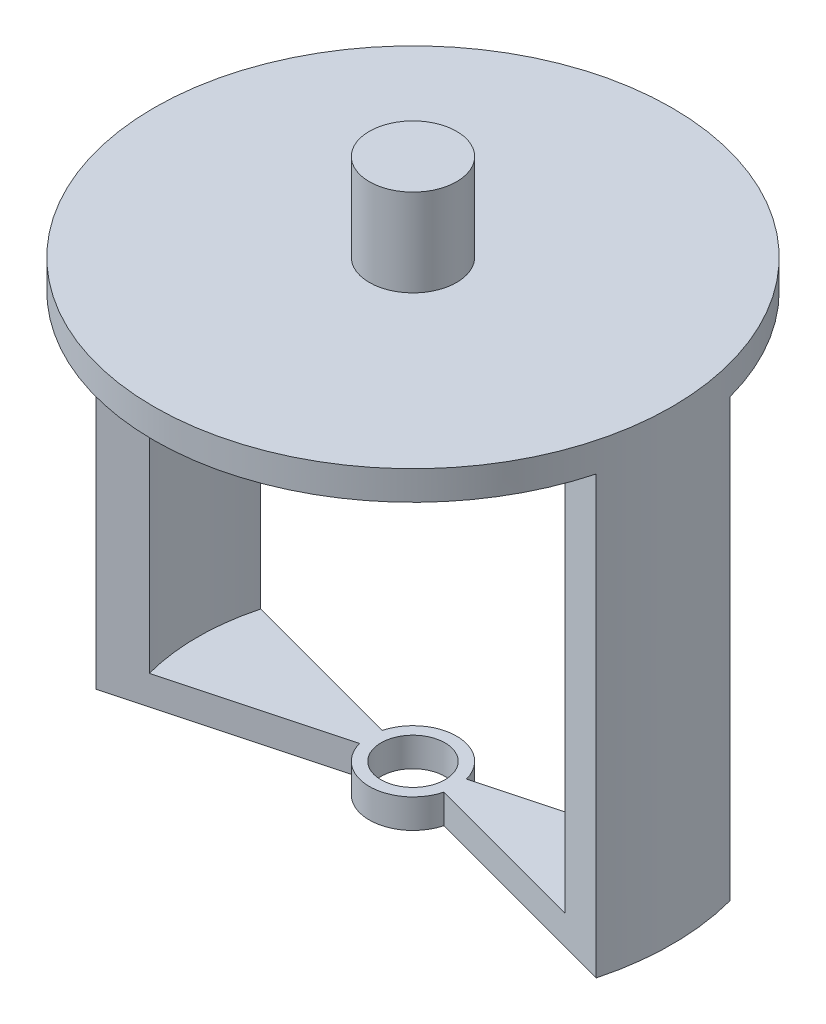
ISO-10303-21;
HEADER;
FILE_DESCRIPTION(('STEP AP214'),'2;1');
FILE_NAME('part.step','',(''),(''),'','','');
FILE_SCHEMA(('AUTOMOTIVE_DESIGN { 1 0 10303 214 1 1 1 1 }'));
ENDSEC;
DATA;
#1=APPLICATION_CONTEXT('core data for automotive mechanical design processes');
#2=APPLICATION_PROTOCOL_DEFINITION('international standard','automotive_design',2000,#1);
#3=PRODUCT_CONTEXT('',#1,'mechanical');
#4=PRODUCT('Part','Part','',(#3));
#5=PRODUCT_RELATED_PRODUCT_CATEGORY('part','',(#4));
#6=PRODUCT_DEFINITION_FORMATION('','',#4);
#7=PRODUCT_DEFINITION_CONTEXT('part definition',#1,'design');
#8=PRODUCT_DEFINITION('design','',#6,#7);
#9=PRODUCT_DEFINITION_SHAPE('','',#8);
#10=(LENGTH_UNIT() NAMED_UNIT(*) SI_UNIT(.MILLI.,.METRE.));
#11=(NAMED_UNIT(*) PLANE_ANGLE_UNIT() SI_UNIT($,.RADIAN.));
#12=(NAMED_UNIT(*) SI_UNIT($,.STERADIAN.) SOLID_ANGLE_UNIT());
#13=UNCERTAINTY_MEASURE_WITH_UNIT(LENGTH_MEASURE(1.E-05),#10,'distance_accuracy_value','');
#14=(GEOMETRIC_REPRESENTATION_CONTEXT(3) GLOBAL_UNCERTAINTY_ASSIGNED_CONTEXT((#13)) GLOBAL_UNIT_ASSIGNED_CONTEXT((#10,
#11,#12)) REPRESENTATION_CONTEXT('',''));
#15=CARTESIAN_POINT('',(0.,0.,0.));
#16=DIRECTION('',(0.,0.,1.));
#17=DIRECTION('',(1.,0.,0.));
#18=AXIS2_PLACEMENT_3D('',#15,#16,#17);
#19=CARTESIAN_POINT('',(0.,-40.,0.));
#20=DIRECTION('',(0.,1.,0.));
#21=DIRECTION('',(0.,0.,1.));
#22=AXIS2_PLACEMENT_3D('',#19,#20,#21);
#23=CYLINDRICAL_SURFACE('',#22,44.5);
#24=DIRECTION('',(0.,-1.,0.));
#25=VECTOR('',#24,1.);
#26=CARTESIAN_POINT('',(-42.9836992698635,35.,-11.5174475070622));
#27=LINE('',#26,#25);
#28=CARTESIAN_POINT('',(-42.9836992698635,35.,-11.5174475070622));
#29=VERTEX_POINT('',#28);
#30=CARTESIAN_POINT('',(-42.9836992698635,-40.,-11.5174475070622));
#31=VERTEX_POINT('',#30);
#32=EDGE_CURVE('E155',#29,#31,#27,.T.);
#33=ORIENTED_EDGE('',*,*,#32,.T.);
#34=CARTESIAN_POINT('',(0.,-40.,0.));
#35=DIRECTION('',(0.,1.,0.));
#36=DIRECTION('',(0.,0.,1.));
#37=AXIS2_PLACEMENT_3D('',#34,#35,#36);
#38=CIRCLE('',#37,44.5);
#39=CARTESIAN_POINT('',(-42.9836992698635,-40.,11.5174475070622));
#40=VERTEX_POINT('',#39);
#41=EDGE_CURVE('E160',#31,#40,#38,.T.);
#42=ORIENTED_EDGE('',*,*,#41,.T.);
#43=DIRECTION('',(0.,-1.,0.));
#44=VECTOR('',#43,1.);
#45=CARTESIAN_POINT('',(-42.9836992698635,35.,11.5174475070622));
#46=LINE('',#45,#44);
#47=CARTESIAN_POINT('',(-42.9836992698635,35.,11.5174475070622));
#48=VERTEX_POINT('',#47);
#49=EDGE_CURVE('E188',#48,#40,#46,.T.);
#50=ORIENTED_EDGE('',*,*,#49,.F.);
#51=CARTESIAN_POINT('',(0.,35.,0.));
#52=DIRECTION('',(0.,1.,0.));
#53=DIRECTION('',(0.,0.,1.));
#54=AXIS2_PLACEMENT_3D('',#51,#52,#53);
#55=CIRCLE('',#54,44.5);
#56=CARTESIAN_POINT('',(42.9836992698635,35.,11.5174475070622));
#57=VERTEX_POINT('',#56);
#58=EDGE_CURVE('E186',#57,#48,#55,.F.);
#59=ORIENTED_EDGE('',*,*,#58,.F.);
#60=DIRECTION('',(0.,-1.,0.));
#61=VECTOR('',#60,1.);
#62=CARTESIAN_POINT('',(42.9836992698635,35.,11.5174475070622));
#63=LINE('',#62,#61);
#64=CARTESIAN_POINT('',(42.9836992698635,-40.,11.5174475070622));
#65=VERTEX_POINT('',#64);
#66=EDGE_CURVE('E218',#57,#65,#63,.T.);
#67=ORIENTED_EDGE('',*,*,#66,.T.);
#68=CARTESIAN_POINT('',(42.9836992698635,-40.,-11.5174475070622));
#69=VERTEX_POINT('',#68);
#70=EDGE_CURVE('E182',#65,#69,#38,.T.);
#71=ORIENTED_EDGE('',*,*,#70,.T.);
#72=DIRECTION('',(0.,-1.,0.));
#73=VECTOR('',#72,1.);
#74=CARTESIAN_POINT('',(42.9836992698635,35.,-11.5174475070622));
#75=LINE('',#74,#73);
#76=CARTESIAN_POINT('',(42.9836992698635,35.,-11.5174475070622));
#77=VERTEX_POINT('',#76);
#78=EDGE_CURVE('E215',#77,#69,#75,.T.);
#79=ORIENTED_EDGE('',*,*,#78,.F.);
#80=EDGE_CURVE('E163',#29,#77,#55,.F.);
#81=ORIENTED_EDGE('',*,*,#80,.F.);
#82=EDGE_LOOP('',(#33,#42,#50,#59,#67,#71,#79,#81));
#83=FACE_BOUND('',#82,.T.);
#84=CARTESIAN_POINT('',(0.,40.,0.));
#85=DIRECTION('',(0.,1.,0.));
#86=DIRECTION('',(0.,0.,1.));
#87=AXIS2_PLACEMENT_3D('',#84,#85,#86);
#88=CIRCLE('',#87,44.5);
#89=CARTESIAN_POINT('',(0.,40.,44.5));
#90=VERTEX_POINT('',#89);
#91=EDGE_CURVE('E183',#90,#90,#88,.T.);
#92=ORIENTED_EDGE('',*,*,#91,.F.);
#93=EDGE_LOOP('',(#92));
#94=FACE_BOUND('',#93,.T.);
#95=ADVANCED_FACE('F64',(#83,#94),#23,.T.);
#96=CARTESIAN_POINT('',(0.,-40.,0.));
#97=DIRECTION('',(0.,1.,0.));
#98=DIRECTION('',(0.,0.,1.));
#99=AXIS2_PLACEMENT_3D('',#96,#97,#98);
#100=PLANE('',#99);
#101=CARTESIAN_POINT('',(0.,-40.,0.));
#102=DIRECTION('',(0.,1.,0.));
#103=DIRECTION('',(0.,0.,1.));
#104=AXIS2_PLACEMENT_3D('',#101,#102,#103);
#105=CIRCLE('',#104,5.5);
#106=CARTESIAN_POINT('',(0.,-40.,5.5));
#107=VERTEX_POINT('',#106);
#108=EDGE_CURVE('E280',#107,#107,#105,.F.);
#109=ORIENTED_EDGE('',*,*,#108,.F.);
#110=EDGE_LOOP('',(#109));
#111=FACE_BOUND('',#110,.T.);
#112=ORIENTED_EDGE('',*,*,#41,.F.);
#113=DIRECTION('',(-0.965925826289069,0.,-0.25881904510252));
#114=VECTOR('',#113,1.);
#115=CARTESIAN_POINT('',(0.,-40.,0.));
#116=LINE('',#115,#114);
#117=CARTESIAN_POINT('',(-7.24444369716801,-40.,-1.94114283826891));
#118=VERTEX_POINT('',#117);
#119=EDGE_CURVE('E171',#118,#31,#116,.T.);
#120=ORIENTED_EDGE('',*,*,#119,.F.);
#121=CARTESIAN_POINT('',(0.,-40.,0.));
#122=DIRECTION('',(0.,1.,0.));
#123=DIRECTION('',(0.,0.,1.));
#124=AXIS2_PLACEMENT_3D('',#121,#122,#123);
#125=CIRCLE('',#124,7.5);
#126=CARTESIAN_POINT('',(7.24444369716801,-40.,-1.94114283826892));
#127=VERTEX_POINT('',#126);
#128=EDGE_CURVE('E176',#118,#127,#125,.F.);
#129=ORIENTED_EDGE('',*,*,#128,.T.);
#130=DIRECTION('',(0.965925826289068,0.,-0.258819045102522));
#131=VECTOR('',#130,1.);
#132=CARTESIAN_POINT('',(0.,-40.,0.));
#133=LINE('',#132,#131);
#134=EDGE_CURVE('E258',#127,#69,#133,.T.);
#135=ORIENTED_EDGE('',*,*,#134,.T.);
#136=ORIENTED_EDGE('',*,*,#70,.F.);
#137=DIRECTION('',(0.965925826289068,0.,0.258819045102523));
#138=VECTOR('',#137,1.);
#139=CARTESIAN_POINT('',(0.,-40.,0.));
#140=LINE('',#139,#138);
#141=CARTESIAN_POINT('',(7.24444369716802,-40.,1.94114283826891));
#142=VERTEX_POINT('',#141);
#143=EDGE_CURVE('E252',#142,#65,#140,.T.);
#144=ORIENTED_EDGE('',*,*,#143,.F.);
#145=CARTESIAN_POINT('',(0.,-40.,0.));
#146=DIRECTION('',(0.,1.,0.));
#147=DIRECTION('',(0.,0.,1.));
#148=AXIS2_PLACEMENT_3D('',#145,#146,#147);
#149=CIRCLE('',#148,7.5);
#150=CARTESIAN_POINT('',(-7.24444369716802,-40.,1.94114283826891));
#151=VERTEX_POINT('',#150);
#152=EDGE_CURVE('E255',#142,#151,#149,.F.);
#153=ORIENTED_EDGE('',*,*,#152,.T.);
#154=DIRECTION('',(-0.965925826289068,0.,0.258819045102522));
#155=VECTOR('',#154,1.);
#156=CARTESIAN_POINT('',(0.,-40.,0.));
#157=LINE('',#156,#155);
#158=EDGE_CURVE('E181',#151,#40,#157,.T.);
#159=ORIENTED_EDGE('',*,*,#158,.T.);
#160=EDGE_LOOP('',(#112,#120,#129,#135,#136,#144,#153,#159));
#161=FACE_BOUND('',#160,.T.);
#162=ADVANCED_FACE('F179',(#111,#161),#100,.F.);
#163=CARTESIAN_POINT('',(0.,40.,0.));
#164=DIRECTION('',(0.,1.,0.));
#165=DIRECTION('',(0.,0.,1.));
#166=AXIS2_PLACEMENT_3D('',#163,#164,#165);
#167=PLANE('',#166);
#168=CARTESIAN_POINT('',(0.,40.,0.));
#169=DIRECTION('',(0.,1.,0.));
#170=DIRECTION('',(0.,0.,1.));
#171=AXIS2_PLACEMENT_3D('',#168,#169,#170);
#172=CIRCLE('',#171,7.5);
#173=CARTESIAN_POINT('',(0.,40.,7.5));
#174=VERTEX_POINT('',#173);
#175=EDGE_CURVE('E287',#174,#174,#172,.T.);
#176=ORIENTED_EDGE('',*,*,#175,.F.);
#177=EDGE_LOOP('',(#176));
#178=FACE_BOUND('',#177,.T.);
#179=ORIENTED_EDGE('',*,*,#91,.T.);
#180=EDGE_LOOP('',(#179));
#181=FACE_BOUND('',#180,.T.);
#182=ADVANCED_FACE('F302',(#178,#181),#167,.T.);
#183=CARTESIAN_POINT('',(3.87827412774892,35.,0.));
#184=DIRECTION('',(0.,1.,0.));
#185=DIRECTION('',(0.,0.,1.));
#186=AXIS2_PLACEMENT_3D('',#183,#184,#185);
#187=PLANE('',#186);
#188=ORIENTED_EDGE('',*,*,#80,.T.);
#189=DIRECTION('',(-0.965925826289068,0.,0.258819045102523));
#190=VECTOR('',#189,1.);
#191=CARTESIAN_POINT('',(35.7392555726955,35.,-9.5763046687933));
#192=LINE('',#191,#190);
#193=CARTESIAN_POINT('',(35.7392555726955,35.,-9.5763046687933));
#194=VERTEX_POINT('',#193);
#195=EDGE_CURVE('E216',#77,#194,#192,.T.);
#196=ORIENTED_EDGE('',*,*,#195,.T.);
#197=CARTESIAN_POINT('',(0.,35.,0.));
#198=DIRECTION('',(0.,-1.,0.));
#199=DIRECTION('',(0.,0.,1.));
#200=AXIS2_PLACEMENT_3D('',#197,#198,#199);
#201=CIRCLE('',#200,37.);
#202=CARTESIAN_POINT('',(35.7392555726955,35.,9.5763046687933));
#203=VERTEX_POINT('',#202);
#204=EDGE_CURVE('E214',#194,#203,#201,.T.);
#205=ORIENTED_EDGE('',*,*,#204,.T.);
#206=DIRECTION('',(0.965925826289068,0.,0.258819045102523));
#207=VECTOR('',#206,1.);
#208=CARTESIAN_POINT('',(35.7392555726955,35.,9.5763046687933));
#209=LINE('',#208,#207);
#210=EDGE_CURVE('E220',#203,#57,#209,.T.);
#211=ORIENTED_EDGE('',*,*,#210,.T.);
#212=ORIENTED_EDGE('',*,*,#58,.T.);
#213=DIRECTION('',(0.965925826289068,0.,-0.25881904510252));
#214=VECTOR('',#213,1.);
#215=CARTESIAN_POINT('',(-35.7392555726955,35.,9.5763046687933));
#216=LINE('',#215,#214);
#217=CARTESIAN_POINT('',(-35.7392555726955,35.,9.5763046687933));
#218=VERTEX_POINT('',#217);
#219=EDGE_CURVE('E228',#48,#218,#216,.T.);
#220=ORIENTED_EDGE('',*,*,#219,.T.);
#221=CARTESIAN_POINT('',(0.,35.,0.));
#222=DIRECTION('',(0.,-1.,0.));
#223=DIRECTION('',(0.,0.,-1.));
#224=AXIS2_PLACEMENT_3D('',#221,#222,#223);
#225=CIRCLE('',#224,37.);
#226=CARTESIAN_POINT('',(-35.7392555726955,35.,-9.5763046687933));
#227=VERTEX_POINT('',#226);
#228=EDGE_CURVE('E230',#218,#227,#225,.T.);
#229=ORIENTED_EDGE('',*,*,#228,.T.);
#230=DIRECTION('',(-0.965925826289068,0.,-0.25881904510252));
#231=VECTOR('',#230,1.);
#232=CARTESIAN_POINT('',(-35.7392555726955,35.,-9.5763046687933));
#233=LINE('',#232,#231);
#234=EDGE_CURVE('E167',#227,#29,#233,.T.);
#235=ORIENTED_EDGE('',*,*,#234,.T.);
#236=EDGE_LOOP('',(#188,#196,#205,#211,#212,#220,#229,#235));
#237=FACE_BOUND('',#236,.T.);
#238=ADVANCED_FACE('F246',(#237),#187,.F.);
#239=CARTESIAN_POINT('',(-35.7392555726955,35.,9.5763046687933));
#240=DIRECTION('',(-0.25881904510252,0.,-0.965925826289068));
#241=DIRECTION('',(-0.965925826289068,0.,0.25881904510252));
#242=AXIS2_PLACEMENT_3D('',#239,#240,#241);
#243=PLANE('',#242);
#244=DIRECTION('',(0.,-1.,0.));
#245=VECTOR('',#244,1.);
#246=CARTESIAN_POINT('',(-35.7392555726955,35.,9.5763046687933));
#247=LINE('',#246,#245);
#248=CARTESIAN_POINT('',(-35.7392555726955,-35.,9.5763046687933));
#249=VERTEX_POINT('',#248);
#250=EDGE_CURVE('E236',#218,#249,#247,.T.);
#251=ORIENTED_EDGE('',*,*,#250,.F.);
#252=ORIENTED_EDGE('',*,*,#219,.F.);
#253=ORIENTED_EDGE('',*,*,#49,.T.);
#254=ORIENTED_EDGE('',*,*,#158,.F.);
#255=DIRECTION('',(0.,1.,0.));
#256=VECTOR('',#255,1.);
#257=CARTESIAN_POINT('',(-7.24444369716802,-40.001,1.94114283826891));
#258=LINE('',#257,#256);
#259=CARTESIAN_POINT('',(-7.24444369716802,-35.,1.94114283826891));
#260=VERTEX_POINT('',#259);
#261=EDGE_CURVE('E270',#151,#260,#258,.T.);
#262=ORIENTED_EDGE('',*,*,#261,.T.);
#263=DIRECTION('',(0.965925826289068,0.,-0.258819045102522));
#264=VECTOR('',#263,1.);
#265=CARTESIAN_POINT('',(3.6184790226097,-35.,-0.969568531937237));
#266=LINE('',#265,#264);
#267=EDGE_CURVE('E193',#249,#260,#266,.T.);
#268=ORIENTED_EDGE('',*,*,#267,.F.);
#269=EDGE_LOOP('',(#251,#252,#253,#254,#262,#268));
#270=FACE_BOUND('',#269,.T.);
#271=ADVANCED_FACE('F241',(#270),#243,.F.);
#272=CARTESIAN_POINT('',(0.,35.,0.));
#273=DIRECTION('',(0.,-1.,0.));
#274=DIRECTION('',(0.,0.,-1.));
#275=AXIS2_PLACEMENT_3D('',#272,#273,#274);
#276=CYLINDRICAL_SURFACE('',#275,37.);
#277=DIRECTION('',(0.,-1.,0.));
#278=VECTOR('',#277,1.);
#279=CARTESIAN_POINT('',(-35.7392555726955,35.,-9.57630466879331));
#280=LINE('',#279,#278);
#281=CARTESIAN_POINT('',(-35.7392555726955,-35.,-9.5763046687933));
#282=VERTEX_POINT('',#281);
#283=EDGE_CURVE('E166',#227,#282,#280,.T.);
#284=ORIENTED_EDGE('',*,*,#283,.F.);
#285=ORIENTED_EDGE('',*,*,#228,.F.);
#286=ORIENTED_EDGE('',*,*,#250,.T.);
#287=CARTESIAN_POINT('',(0.,-35.,0.));
#288=DIRECTION('',(0.,-1.,0.));
#289=DIRECTION('',(0.,0.,-1.));
#290=AXIS2_PLACEMENT_3D('',#287,#288,#289);
#291=CIRCLE('',#290,37.);
#292=EDGE_CURVE('E263',#249,#282,#291,.T.);
#293=ORIENTED_EDGE('',*,*,#292,.T.);
#294=EDGE_LOOP('',(#284,#285,#286,#293));
#295=FACE_BOUND('',#294,.T.);
#296=ADVANCED_FACE('F264',(#295),#276,.F.);
#297=CARTESIAN_POINT('',(-35.7392555726955,35.,-9.5763046687933));
#298=DIRECTION('',(-0.25881904510252,0.,0.965925826289068));
#299=DIRECTION('',(0.965925826289068,0.,0.25881904510252));
#300=AXIS2_PLACEMENT_3D('',#297,#298,#299);
#301=PLANE('',#300);
#302=ORIENTED_EDGE('',*,*,#32,.F.);
#303=ORIENTED_EDGE('',*,*,#234,.F.);
#304=ORIENTED_EDGE('',*,*,#283,.T.);
#305=DIRECTION('',(0.965925826289069,0.,0.25881904510252));
#306=VECTOR('',#305,1.);
#307=CARTESIAN_POINT('',(3.61847902260972,-35.,0.969568531937171));
#308=LINE('',#307,#306);
#309=CARTESIAN_POINT('',(-7.24444369716802,-35.,-1.94114283826892));
#310=VERTEX_POINT('',#309);
#311=EDGE_CURVE('E13',#282,#310,#308,.T.);
#312=ORIENTED_EDGE('',*,*,#311,.T.);
#313=DIRECTION('',(0.,1.,0.));
#314=VECTOR('',#313,1.);
#315=CARTESIAN_POINT('',(-7.24444369716802,-40.001,-1.94114283826892));
#316=LINE('',#315,#314);
#317=EDGE_CURVE('E173',#118,#310,#316,.T.);
#318=ORIENTED_EDGE('',*,*,#317,.F.);
#319=ORIENTED_EDGE('',*,*,#119,.T.);
#320=EDGE_LOOP('',(#302,#303,#304,#312,#318,#319));
#321=FACE_BOUND('',#320,.T.);
#322=ADVANCED_FACE('F172',(#321),#301,.F.);
#323=CARTESIAN_POINT('',(0.,35.,0.));
#324=DIRECTION('',(0.,-1.,0.));
#325=DIRECTION('',(0.,0.,-1.));
#326=AXIS2_PLACEMENT_3D('',#323,#324,#325);
#327=CYLINDRICAL_SURFACE('',#326,37.);
#328=DIRECTION('',(0.,-1.,0.));
#329=VECTOR('',#328,1.);
#330=CARTESIAN_POINT('',(35.7392555726955,35.,9.5763046687933));
#331=LINE('',#330,#329);
#332=CARTESIAN_POINT('',(35.7392555726955,-35.,9.5763046687933));
#333=VERTEX_POINT('',#332);
#334=EDGE_CURVE('E225',#203,#333,#331,.T.);
#335=ORIENTED_EDGE('',*,*,#334,.F.);
#336=ORIENTED_EDGE('',*,*,#204,.F.);
#337=DIRECTION('',(0.,-1.,0.));
#338=VECTOR('',#337,1.);
#339=CARTESIAN_POINT('',(35.7392555726955,35.,-9.5763046687933));
#340=LINE('',#339,#338);
#341=CARTESIAN_POINT('',(35.7392555726955,-35.,-9.5763046687933));
#342=VERTEX_POINT('',#341);
#343=EDGE_CURVE('E208',#194,#342,#340,.T.);
#344=ORIENTED_EDGE('',*,*,#343,.T.);
#345=CARTESIAN_POINT('',(0.,-35.,0.));
#346=DIRECTION('',(0.,-1.,0.));
#347=DIRECTION('',(0.,0.,1.));
#348=AXIS2_PLACEMENT_3D('',#345,#346,#347);
#349=CIRCLE('',#348,37.);
#350=EDGE_CURVE('E202',#342,#333,#349,.T.);
#351=ORIENTED_EDGE('',*,*,#350,.T.);
#352=EDGE_LOOP('',(#335,#336,#344,#351));
#353=FACE_BOUND('',#352,.T.);
#354=ADVANCED_FACE('F213',(#353),#327,.F.);
#355=CARTESIAN_POINT('',(35.7392555726955,35.,9.5763046687933));
#356=DIRECTION('',(0.258819045102523,0.,-0.965925826289068));
#357=DIRECTION('',(-0.965925826289068,0.,-0.258819045102523));
#358=AXIS2_PLACEMENT_3D('',#355,#356,#357);
#359=PLANE('',#358);
#360=ORIENTED_EDGE('',*,*,#66,.F.);
#361=ORIENTED_EDGE('',*,*,#210,.F.);
#362=ORIENTED_EDGE('',*,*,#334,.T.);
#363=DIRECTION('',(-0.965925826289068,0.,-0.258819045102523));
#364=VECTOR('',#363,1.);
#365=CARTESIAN_POINT('',(3.61847902260971,-35.,0.969568531937192));
#366=LINE('',#365,#364);
#367=CARTESIAN_POINT('',(7.24444369716801,-35.,1.94114283826891));
#368=VERTEX_POINT('',#367);
#369=EDGE_CURVE('E196',#333,#368,#366,.T.);
#370=ORIENTED_EDGE('',*,*,#369,.T.);
#371=DIRECTION('',(0.,1.,0.));
#372=VECTOR('',#371,1.);
#373=CARTESIAN_POINT('',(7.24444369716801,-40.001,1.94114283826891));
#374=LINE('',#373,#372);
#375=EDGE_CURVE('E254',#142,#368,#374,.T.);
#376=ORIENTED_EDGE('',*,*,#375,.F.);
#377=ORIENTED_EDGE('',*,*,#143,.T.);
#378=EDGE_LOOP('',(#360,#361,#362,#370,#376,#377));
#379=FACE_BOUND('',#378,.T.);
#380=ADVANCED_FACE('F249',(#379),#359,.F.);
#381=CARTESIAN_POINT('',(35.7392555726955,35.,-9.5763046687933));
#382=DIRECTION('',(0.258819045102523,0.,0.965925826289068));
#383=DIRECTION('',(0.965925826289068,0.,-0.258819045102523));
#384=AXIS2_PLACEMENT_3D('',#381,#382,#383);
#385=PLANE('',#384);
#386=ORIENTED_EDGE('',*,*,#343,.F.);
#387=ORIENTED_EDGE('',*,*,#195,.F.);
#388=ORIENTED_EDGE('',*,*,#78,.T.);
#389=ORIENTED_EDGE('',*,*,#134,.F.);
#390=DIRECTION('',(0.,1.,0.));
#391=VECTOR('',#390,1.);
#392=CARTESIAN_POINT('',(7.24444369716801,-40.001,-1.94114283826892));
#393=LINE('',#392,#391);
#394=CARTESIAN_POINT('',(7.24444369716801,-35.,-1.94114283826892));
#395=VERTEX_POINT('',#394);
#396=EDGE_CURVE('E210',#127,#395,#393,.T.);
#397=ORIENTED_EDGE('',*,*,#396,.T.);
#398=DIRECTION('',(-0.965925826289068,0.,0.258819045102522));
#399=VECTOR('',#398,1.);
#400=CARTESIAN_POINT('',(3.6184790226097,-35.,-0.969568531937237));
#401=LINE('',#400,#399);
#402=EDGE_CURVE('E71',#342,#395,#401,.T.);
#403=ORIENTED_EDGE('',*,*,#402,.F.);
#404=EDGE_LOOP('',(#386,#387,#388,#389,#397,#403));
#405=FACE_BOUND('',#404,.T.);
#406=ADVANCED_FACE('F206',(#405),#385,.F.);
#407=CARTESIAN_POINT('',(3.87827412774892,-35.,0.));
#408=DIRECTION('',(0.,1.,0.));
#409=DIRECTION('',(0.,0.,1.));
#410=AXIS2_PLACEMENT_3D('',#407,#408,#409);
#411=PLANE('',#410);
#412=CARTESIAN_POINT('',(0.,-35.,0.));
#413=DIRECTION('',(0.,1.,0.));
#414=DIRECTION('',(0.,0.,1.));
#415=AXIS2_PLACEMENT_3D('',#412,#413,#414);
#416=CIRCLE('',#415,5.5);
#417=CARTESIAN_POINT('',(0.,-35.,5.5));
#418=VERTEX_POINT('',#417);
#419=EDGE_CURVE('E283',#418,#418,#416,.T.);
#420=ORIENTED_EDGE('',*,*,#419,.F.);
#421=EDGE_LOOP('',(#420));
#422=FACE_BOUND('',#421,.T.);
#423=ORIENTED_EDGE('',*,*,#311,.F.);
#424=ORIENTED_EDGE('',*,*,#292,.F.);
#425=ORIENTED_EDGE('',*,*,#267,.T.);
#426=CARTESIAN_POINT('',(0.,-35.,0.));
#427=DIRECTION('',(0.,1.,0.));
#428=DIRECTION('',(0.,0.,1.));
#429=AXIS2_PLACEMENT_3D('',#426,#427,#428);
#430=CIRCLE('',#429,7.5);
#431=EDGE_CURVE('E86',#260,#368,#430,.T.);
#432=ORIENTED_EDGE('',*,*,#431,.T.);
#433=ORIENTED_EDGE('',*,*,#369,.F.);
#434=ORIENTED_EDGE('',*,*,#350,.F.);
#435=ORIENTED_EDGE('',*,*,#402,.T.);
#436=CARTESIAN_POINT('',(0.,-35.,0.));
#437=DIRECTION('',(0.,1.,0.));
#438=DIRECTION('',(0.,0.,1.));
#439=AXIS2_PLACEMENT_3D('',#436,#437,#438);
#440=CIRCLE('',#439,7.5);
#441=EDGE_CURVE('E78',#395,#310,#440,.T.);
#442=ORIENTED_EDGE('',*,*,#441,.T.);
#443=EDGE_LOOP('',(#423,#424,#425,#432,#433,#434,#435,#442));
#444=FACE_BOUND('',#443,.T.);
#445=ADVANCED_FACE('F200',(#422,#444),#411,.T.);
#446=CARTESIAN_POINT('',(0.,-40.001,0.));
#447=DIRECTION('',(0.,1.,0.));
#448=DIRECTION('',(0.,0.,1.));
#449=AXIS2_PLACEMENT_3D('',#446,#447,#448);
#450=CYLINDRICAL_SURFACE('',#449,7.5);
#451=ORIENTED_EDGE('',*,*,#375,.T.);
#452=ORIENTED_EDGE('',*,*,#431,.F.);
#453=ORIENTED_EDGE('',*,*,#261,.F.);
#454=ORIENTED_EDGE('',*,*,#152,.F.);
#455=EDGE_LOOP('',(#451,#452,#453,#454));
#456=FACE_BOUND('',#455,.T.);
#457=ADVANCED_FACE('F332',(#456),#450,.T.);
#458=CARTESIAN_POINT('',(0.,-40.001,0.));
#459=DIRECTION('',(0.,1.,0.));
#460=DIRECTION('',(0.,0.,1.));
#461=AXIS2_PLACEMENT_3D('',#458,#459,#460);
#462=CYLINDRICAL_SURFACE('',#461,7.5);
#463=ORIENTED_EDGE('',*,*,#317,.T.);
#464=ORIENTED_EDGE('',*,*,#441,.F.);
#465=ORIENTED_EDGE('',*,*,#396,.F.);
#466=ORIENTED_EDGE('',*,*,#128,.F.);
#467=EDGE_LOOP('',(#463,#464,#465,#466));
#468=FACE_BOUND('',#467,.T.);
#469=ADVANCED_FACE('F336',(#468),#462,.T.);
#470=CARTESIAN_POINT('',(0.,-40.001,0.));
#471=DIRECTION('',(0.,1.,0.));
#472=DIRECTION('',(0.,0.,1.));
#473=AXIS2_PLACEMENT_3D('',#470,#471,#472);
#474=CYLINDRICAL_SURFACE('',#473,5.5);
#475=ORIENTED_EDGE('',*,*,#419,.T.);
#476=EDGE_LOOP('',(#475));
#477=FACE_BOUND('',#476,.T.);
#478=ORIENTED_EDGE('',*,*,#108,.T.);
#479=EDGE_LOOP('',(#478));
#480=FACE_BOUND('',#479,.T.);
#481=ADVANCED_FACE('F298',(#477,#480),#474,.F.);
#482=CARTESIAN_POINT('',(0.,55.,0.));
#483=DIRECTION('',(0.,-1.,0.));
#484=DIRECTION('',(0.,0.,-1.));
#485=AXIS2_PLACEMENT_3D('',#482,#483,#484);
#486=CYLINDRICAL_SURFACE('',#485,7.5);
#487=CARTESIAN_POINT('',(0.,55.,0.));
#488=DIRECTION('',(0.,1.,0.));
#489=DIRECTION('',(0.,0.,1.));
#490=AXIS2_PLACEMENT_3D('',#487,#488,#489);
#491=CIRCLE('',#490,7.5);
#492=CARTESIAN_POINT('',(0.,55.,7.5));
#493=VERTEX_POINT('',#492);
#494=EDGE_CURVE('E286',#493,#493,#491,.T.);
#495=ORIENTED_EDGE('',*,*,#494,.F.);
#496=EDGE_LOOP('',(#495));
#497=FACE_BOUND('',#496,.T.);
#498=ORIENTED_EDGE('',*,*,#175,.T.);
#499=EDGE_LOOP('',(#498));
#500=FACE_BOUND('',#499,.T.);
#501=ADVANCED_FACE('F295',(#497,#500),#486,.T.);
#502=CARTESIAN_POINT('',(0.,55.,0.));
#503=DIRECTION('',(0.,1.,0.));
#504=DIRECTION('',(0.,0.,1.));
#505=AXIS2_PLACEMENT_3D('',#502,#503,#504);
#506=PLANE('',#505);
#507=ORIENTED_EDGE('',*,*,#494,.T.);
#508=EDGE_LOOP('',(#507));
#509=FACE_BOUND('',#508,.T.);
#510=ADVANCED_FACE('F293',(#509),#506,.T.);
#511=CLOSED_SHELL('',(#95,#162,#182,#238,#271,#296,#322,#354,#380,#406,#445,#457,#469,#481,#501,#510));
#512=MANIFOLD_SOLID_BREP('B2',#511);
#513=ADVANCED_BREP_SHAPE_REPRESENTATION('',(#18,#512),#14);
#514=SHAPE_DEFINITION_REPRESENTATION(#9,#513);
ENDSEC;
END-ISO-10303-21;
